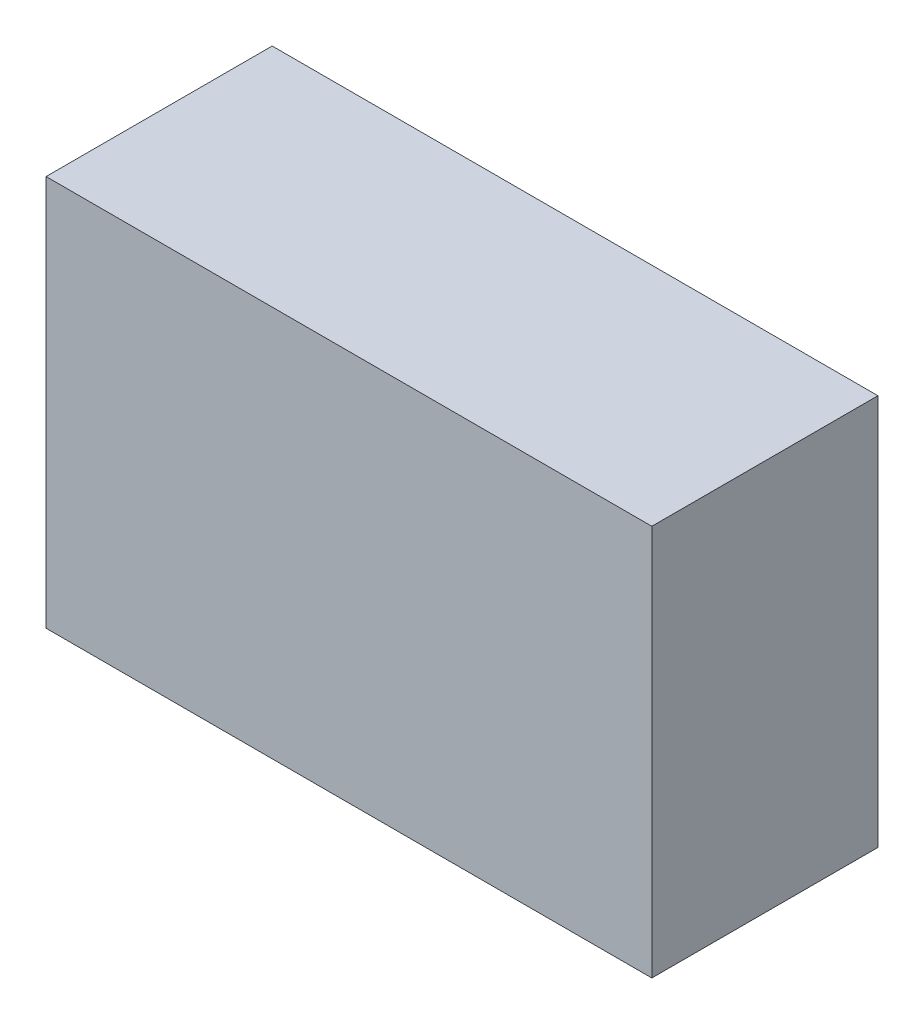
ISO-10303-21;
HEADER;
FILE_DESCRIPTION(('STEP AP214'),'2;1');
FILE_NAME('part.step','',(''),(''),'','','');
FILE_SCHEMA(('AUTOMOTIVE_DESIGN { 1 0 10303 214 1 1 1 1 }'));
ENDSEC;
DATA;
#1=APPLICATION_CONTEXT('core data for automotive mechanical design processes');
#2=APPLICATION_PROTOCOL_DEFINITION('international standard','automotive_design',2000,#1);
#3=PRODUCT_CONTEXT('',#1,'mechanical');
#4=PRODUCT('Part','Part','',(#3));
#5=PRODUCT_RELATED_PRODUCT_CATEGORY('part','',(#4));
#6=PRODUCT_DEFINITION_FORMATION('','',#4);
#7=PRODUCT_DEFINITION_CONTEXT('part definition',#1,'design');
#8=PRODUCT_DEFINITION('design','',#6,#7);
#9=PRODUCT_DEFINITION_SHAPE('','',#8);
#10=(LENGTH_UNIT() NAMED_UNIT(*) SI_UNIT(.MILLI.,.METRE.));
#11=(NAMED_UNIT(*) PLANE_ANGLE_UNIT() SI_UNIT($,.RADIAN.));
#12=(NAMED_UNIT(*) SI_UNIT($,.STERADIAN.) SOLID_ANGLE_UNIT());
#13=UNCERTAINTY_MEASURE_WITH_UNIT(LENGTH_MEASURE(1.E-05),#10,'distance_accuracy_value','');
#14=(GEOMETRIC_REPRESENTATION_CONTEXT(3) GLOBAL_UNCERTAINTY_ASSIGNED_CONTEXT((#13)) GLOBAL_UNIT_ASSIGNED_CONTEXT((#10,
#11,#12)) REPRESENTATION_CONTEXT('',''));
#15=CARTESIAN_POINT('',(0.,0.,0.));
#16=DIRECTION('',(0.,0.,1.));
#17=DIRECTION('',(1.,0.,0.));
#18=AXIS2_PLACEMENT_3D('',#15,#16,#17);
#19=CARTESIAN_POINT('',(0.,0.,107.5));
#20=DIRECTION('',(1.,0.,0.));
#21=DIRECTION('',(0.,0.,-1.));
#22=AXIS2_PLACEMENT_3D('',#19,#20,#21);
#23=PLANE('',#22);
#24=DIRECTION('',(0.,-1.,0.));
#25=VECTOR('',#24,1.);
#26=CARTESIAN_POINT('',(0.,0.,0.));
#27=LINE('',#26,#25);
#28=CARTESIAN_POINT('',(0.,186.,0.));
#29=VERTEX_POINT('',#28);
#30=CARTESIAN_POINT('',(0.,0.,0.));
#31=VERTEX_POINT('',#30);
#32=EDGE_CURVE('E99',#29,#31,#27,.T.);
#33=ORIENTED_EDGE('',*,*,#32,.T.);
#34=DIRECTION('',(0.,0.,-1.));
#35=VECTOR('',#34,1.);
#36=CARTESIAN_POINT('',(0.,0.,107.5));
#37=LINE('',#36,#35);
#38=CARTESIAN_POINT('',(0.,0.,107.5));
#39=VERTEX_POINT('',#38);
#40=EDGE_CURVE('E11',#39,#31,#37,.T.);
#41=ORIENTED_EDGE('',*,*,#40,.F.);
#42=DIRECTION('',(0.,-1.,0.));
#43=VECTOR('',#42,1.);
#44=CARTESIAN_POINT('',(0.,0.,107.5));
#45=LINE('',#44,#43);
#46=CARTESIAN_POINT('',(0.,186.,107.5));
#47=VERTEX_POINT('',#46);
#48=EDGE_CURVE('E87',#47,#39,#45,.T.);
#49=ORIENTED_EDGE('',*,*,#48,.F.);
#50=DIRECTION('',(0.,0.,-1.));
#51=VECTOR('',#50,1.);
#52=CARTESIAN_POINT('',(0.,186.,107.5));
#53=LINE('',#52,#51);
#54=EDGE_CURVE('E95',#47,#29,#53,.T.);
#55=ORIENTED_EDGE('',*,*,#54,.T.);
#56=EDGE_LOOP('',(#33,#41,#49,#55));
#57=FACE_BOUND('',#56,.T.);
#58=ADVANCED_FACE('F36',(#57),#23,.F.);
#59=CARTESIAN_POINT('',(0.,0.,107.5));
#60=DIRECTION('',(0.,1.,0.));
#61=DIRECTION('',(0.,0.,1.));
#62=AXIS2_PLACEMENT_3D('',#59,#60,#61);
#63=PLANE('',#62);
#64=DIRECTION('',(1.,0.,0.));
#65=VECTOR('',#64,1.);
#66=CARTESIAN_POINT('',(0.,0.,0.));
#67=LINE('',#66,#65);
#68=CARTESIAN_POINT('',(288.,0.,0.));
#69=VERTEX_POINT('',#68);
#70=EDGE_CURVE('E91',#31,#69,#67,.T.);
#71=ORIENTED_EDGE('',*,*,#70,.T.);
#72=DIRECTION('',(0.,0.,-1.));
#73=VECTOR('',#72,1.);
#74=CARTESIAN_POINT('',(288.,0.,107.5));
#75=LINE('',#74,#73);
#76=CARTESIAN_POINT('',(288.,0.,107.5));
#77=VERTEX_POINT('',#76);
#78=EDGE_CURVE('E44',#77,#69,#75,.T.);
#79=ORIENTED_EDGE('',*,*,#78,.F.);
#80=DIRECTION('',(1.,0.,0.));
#81=VECTOR('',#80,1.);
#82=CARTESIAN_POINT('',(0.,0.,107.5));
#83=LINE('',#82,#81);
#84=EDGE_CURVE('E82',#39,#77,#83,.T.);
#85=ORIENTED_EDGE('',*,*,#84,.F.);
#86=ORIENTED_EDGE('',*,*,#40,.T.);
#87=EDGE_LOOP('',(#71,#79,#85,#86));
#88=FACE_BOUND('',#87,.T.);
#89=ADVANCED_FACE('F90',(#88),#63,.F.);
#90=CARTESIAN_POINT('',(288.,0.,107.5));
#91=DIRECTION('',(-1.,0.,0.));
#92=DIRECTION('',(0.,0.,1.));
#93=AXIS2_PLACEMENT_3D('',#90,#91,#92);
#94=PLANE('',#93);
#95=DIRECTION('',(0.,1.,0.));
#96=VECTOR('',#95,1.);
#97=CARTESIAN_POINT('',(288.,0.,0.));
#98=LINE('',#97,#96);
#99=CARTESIAN_POINT('',(288.,186.,0.));
#100=VERTEX_POINT('',#99);
#101=EDGE_CURVE('E69',#69,#100,#98,.T.);
#102=ORIENTED_EDGE('',*,*,#101,.T.);
#103=DIRECTION('',(0.,0.,-1.));
#104=VECTOR('',#103,1.);
#105=CARTESIAN_POINT('',(288.,186.,107.5));
#106=LINE('',#105,#104);
#107=CARTESIAN_POINT('',(288.,186.,107.5));
#108=VERTEX_POINT('',#107);
#109=EDGE_CURVE('E92',#108,#100,#106,.T.);
#110=ORIENTED_EDGE('',*,*,#109,.F.);
#111=DIRECTION('',(0.,1.,0.));
#112=VECTOR('',#111,1.);
#113=CARTESIAN_POINT('',(288.,0.,107.5));
#114=LINE('',#113,#112);
#115=EDGE_CURVE('E85',#77,#108,#114,.T.);
#116=ORIENTED_EDGE('',*,*,#115,.F.);
#117=ORIENTED_EDGE('',*,*,#78,.T.);
#118=EDGE_LOOP('',(#102,#110,#116,#117));
#119=FACE_BOUND('',#118,.T.);
#120=ADVANCED_FACE('F93',(#119),#94,.F.);
#121=CARTESIAN_POINT('',(0.,186.,107.5));
#122=DIRECTION('',(0.,-1.,0.));
#123=DIRECTION('',(0.,0.,-1.));
#124=AXIS2_PLACEMENT_3D('',#121,#122,#123);
#125=PLANE('',#124);
#126=DIRECTION('',(-1.,0.,0.));
#127=VECTOR('',#126,1.);
#128=CARTESIAN_POINT('',(0.,186.,0.));
#129=LINE('',#128,#127);
#130=EDGE_CURVE('E75',#100,#29,#129,.T.);
#131=ORIENTED_EDGE('',*,*,#130,.T.);
#132=ORIENTED_EDGE('',*,*,#54,.F.);
#133=DIRECTION('',(-1.,0.,0.));
#134=VECTOR('',#133,1.);
#135=CARTESIAN_POINT('',(0.,186.,107.5));
#136=LINE('',#135,#134);
#137=EDGE_CURVE('E52',#108,#47,#136,.T.);
#138=ORIENTED_EDGE('',*,*,#137,.F.);
#139=ORIENTED_EDGE('',*,*,#109,.T.);
#140=EDGE_LOOP('',(#131,#132,#138,#139));
#141=FACE_BOUND('',#140,.T.);
#142=ADVANCED_FACE('F106',(#141),#125,.F.);
#143=CARTESIAN_POINT('',(0.,0.,107.5));
#144=DIRECTION('',(0.,0.,-1.));
#145=DIRECTION('',(-1.,0.,0.));
#146=AXIS2_PLACEMENT_3D('',#143,#144,#145);
#147=PLANE('',#146);
#148=ORIENTED_EDGE('',*,*,#48,.T.);
#149=ORIENTED_EDGE('',*,*,#84,.T.);
#150=ORIENTED_EDGE('',*,*,#115,.T.);
#151=ORIENTED_EDGE('',*,*,#137,.T.);
#152=EDGE_LOOP('',(#148,#149,#150,#151));
#153=FACE_BOUND('',#152,.T.);
#154=ADVANCED_FACE('F83',(#153),#147,.F.);
#155=CARTESIAN_POINT('',(0.,0.,0.));
#156=DIRECTION('',(0.,0.,-1.));
#157=DIRECTION('',(-1.,0.,0.));
#158=AXIS2_PLACEMENT_3D('',#155,#156,#157);
#159=PLANE('',#158);
#160=ORIENTED_EDGE('',*,*,#32,.F.);
#161=ORIENTED_EDGE('',*,*,#130,.F.);
#162=ORIENTED_EDGE('',*,*,#101,.F.);
#163=ORIENTED_EDGE('',*,*,#70,.F.);
#164=EDGE_LOOP('',(#160,#161,#162,#163));
#165=FACE_BOUND('',#164,.T.);
#166=ADVANCED_FACE('F109',(#165),#159,.T.);
#167=CLOSED_SHELL('',(#58,#89,#120,#142,#154,#166));
#168=MANIFOLD_SOLID_BREP('B2',#167);
#169=ADVANCED_BREP_SHAPE_REPRESENTATION('',(#18,#168),#14);
#170=SHAPE_DEFINITION_REPRESENTATION(#9,#169);
ENDSEC;
END-ISO-10303-21;
